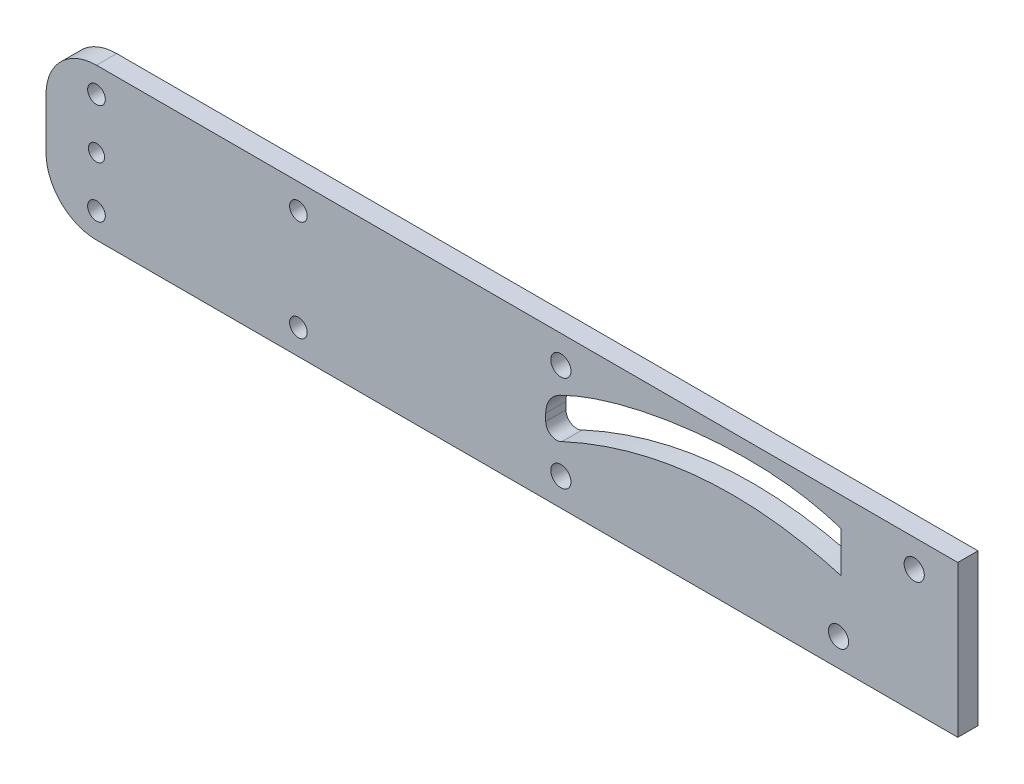
ISO-10303-21;
HEADER;
FILE_DESCRIPTION(('STEP AP214'),'2;1');
FILE_NAME('part.step','',(''),(''),'','','');
FILE_SCHEMA(('AUTOMOTIVE_DESIGN { 1 0 10303 214 1 1 1 1 }'));
ENDSEC;
DATA;
#1=APPLICATION_CONTEXT('core data for automotive mechanical design processes');
#2=APPLICATION_PROTOCOL_DEFINITION('international standard','automotive_design',2000,#1);
#3=PRODUCT_CONTEXT('',#1,'mechanical');
#4=PRODUCT('Part','Part','',(#3));
#5=PRODUCT_RELATED_PRODUCT_CATEGORY('part','',(#4));
#6=PRODUCT_DEFINITION_FORMATION('','',#4);
#7=PRODUCT_DEFINITION_CONTEXT('part definition',#1,'design');
#8=PRODUCT_DEFINITION('design','',#6,#7);
#9=PRODUCT_DEFINITION_SHAPE('','',#8);
#10=(LENGTH_UNIT() NAMED_UNIT(*) SI_UNIT(.MILLI.,.METRE.));
#11=(NAMED_UNIT(*) PLANE_ANGLE_UNIT() SI_UNIT($,.RADIAN.));
#12=(NAMED_UNIT(*) SI_UNIT($,.STERADIAN.) SOLID_ANGLE_UNIT());
#13=UNCERTAINTY_MEASURE_WITH_UNIT(LENGTH_MEASURE(1.E-05),#10,'distance_accuracy_value','');
#14=(GEOMETRIC_REPRESENTATION_CONTEXT(3) GLOBAL_UNCERTAINTY_ASSIGNED_CONTEXT((#13)) GLOBAL_UNIT_ASSIGNED_CONTEXT((#10,
#11,#12)) REPRESENTATION_CONTEXT('',''));
#15=CARTESIAN_POINT('',(0.,0.,0.));
#16=DIRECTION('',(0.,0.,1.));
#17=DIRECTION('',(1.,0.,0.));
#18=AXIS2_PLACEMENT_3D('',#15,#16,#17);
#19=CARTESIAN_POINT('',(-61.74271371787,-0.880933602132559,10.));
#20=CARTESIAN_POINT('',(-32.6636334906638,12.5455996530614,10.));
#21=CARTESIAN_POINT('',(-3.21353823021199,2.72288002919137,10.));
#22=B_SPLINE_CURVE_WITH_KNOTS('',2,(#19,#20,#21),.UNSPECIFIED.,.F.,.F.,(3,3),(0.,1.),.UNSPECIFIED.);
#23=DIRECTION('',(0.,0.,1.));
#24=VECTOR('',#23,1.);
#25=SURFACE_OF_LINEAR_EXTRUSION('',#22,#24);
#26=DIRECTION('',(0.,0.,1.));
#27=VECTOR('',#26,1.);
#28=CARTESIAN_POINT('',(-61.74271371787,-0.88093360213256,10.));
#29=LINE('',#28,#27);
#30=CARTESIAN_POINT('',(-61.74271371787,-0.88093360213256,16.));
#31=VERTEX_POINT('',#30);
#32=CARTESIAN_POINT('',(-61.74271371787,-0.88093360213256,20.));
#33=VERTEX_POINT('',#32);
#34=EDGE_CURVE('E154',#31,#33,#29,.T.);
#35=ORIENTED_EDGE('',*,*,#34,.T.);
#36=CARTESIAN_POINT('',(-61.74271371787,-0.880933602132559,20.));
#37=CARTESIAN_POINT('',(-32.6636334906638,12.5455996530614,20.));
#38=CARTESIAN_POINT('',(-3.21353823021199,2.72288002919137,20.));
#39=B_SPLINE_CURVE_WITH_KNOTS('',2,(#36,#37,#38),.UNSPECIFIED.,.F.,.F.,(3,3),(0.,1.),.UNSPECIFIED.);
#40=CARTESIAN_POINT('',(-6.49935616242203,3.74680495628913,20.));
#41=VERTEX_POINT('',#40);
#42=EDGE_CURVE('E137',#33,#41,#39,.T.);
#43=ORIENTED_EDGE('',*,*,#42,.T.);
#44=DIRECTION('',(0.,0.,1.));
#45=VECTOR('',#44,1.);
#46=CARTESIAN_POINT('',(-6.49935616242203,3.74680495607621,25.5));
#47=LINE('',#46,#45);
#48=CARTESIAN_POINT('',(-6.49935616315701,3.74680495628913,16.));
#49=VERTEX_POINT('',#48);
#50=EDGE_CURVE('E234',#41,#49,#47,.F.);
#51=ORIENTED_EDGE('',*,*,#50,.T.);
#52=CARTESIAN_POINT('',(-61.74271371787,-0.880933602132559,16.));
#53=CARTESIAN_POINT('',(-32.6636334906638,12.5455996530614,16.));
#54=CARTESIAN_POINT('',(-3.21353823021199,2.72288002919137,16.));
#55=B_SPLINE_CURVE_WITH_KNOTS('',2,(#52,#53,#54),.UNSPECIFIED.,.F.,.F.,(3,3),(0.,1.),.UNSPECIFIED.);
#56=EDGE_CURVE('E257',#31,#49,#55,.T.);
#57=ORIENTED_EDGE('',*,*,#56,.F.);
#58=EDGE_LOOP('',(#35,#43,#51,#57));
#59=FACE_BOUND('',#58,.T.);
#60=ADVANCED_FACE('F35',(#59),#25,.F.);
#61=CARTESIAN_POINT('',(-62.8625417760023,0.939701665996412,10.));
#62=DIRECTION('',(0.,0.,1.));
#63=DIRECTION('',(1.,0.,0.));
#64=AXIS2_PLACEMENT_3D('',#61,#62,#63);
#65=CYLINDRICAL_SURFACE('',#64,2.13745822399768);
#66=CARTESIAN_POINT('',(-62.8625417760023,0.939701665996412,20.));
#67=DIRECTION('',(0.,0.,-1.));
#68=DIRECTION('',(0.,1.,0.));
#69=AXIS2_PLACEMENT_3D('',#66,#67,#68);
#70=CIRCLE('',#69,2.13745822399768);
#71=CARTESIAN_POINT('',(-65.,0.939701665996412,20.));
#72=VERTEX_POINT('',#71);
#73=EDGE_CURVE('E221',#33,#72,#70,.T.);
#74=ORIENTED_EDGE('',*,*,#73,.F.);
#75=ORIENTED_EDGE('',*,*,#34,.F.);
#76=CARTESIAN_POINT('',(-62.8625417760023,0.939701665996412,16.));
#77=DIRECTION('',(0.,0.,-1.));
#78=DIRECTION('',(-1.,0.,0.));
#79=AXIS2_PLACEMENT_3D('',#76,#77,#78);
#80=CIRCLE('',#79,2.13745822399768);
#81=CARTESIAN_POINT('',(-65.,0.939701665996412,16.));
#82=VERTEX_POINT('',#81);
#83=EDGE_CURVE('E254',#31,#82,#80,.T.);
#84=ORIENTED_EDGE('',*,*,#83,.T.);
#85=DIRECTION('',(0.,0.,1.));
#86=VECTOR('',#85,1.);
#87=CARTESIAN_POINT('',(-65.,0.939701665996412,10.));
#88=LINE('',#87,#86);
#89=EDGE_CURVE('E372',#82,#72,#88,.T.);
#90=ORIENTED_EDGE('',*,*,#89,.T.);
#91=EDGE_LOOP('',(#74,#75,#84,#90));
#92=FACE_BOUND('',#91,.T.);
#93=ADVANCED_FACE('F280',(#92),#65,.F.);
#94=CARTESIAN_POINT('',(-65.,6.33697436120582E-13,10.));
#95=DIRECTION('',(1.,0.,0.));
#96=DIRECTION('',(0.,1.,0.));
#97=AXIS2_PLACEMENT_3D('',#94,#95,#96);
#98=PLANE('',#97);
#99=DIRECTION('',(0.,1.,0.));
#100=VECTOR('',#99,1.);
#101=CARTESIAN_POINT('',(-65.,6.34853775883272E-13,20.));
#102=LINE('',#101,#100);
#103=CARTESIAN_POINT('',(-64.9999999999993,2.36318258305711,20.));
#104=VERTEX_POINT('',#103);
#105=EDGE_CURVE('E219',#72,#104,#102,.T.);
#106=ORIENTED_EDGE('',*,*,#105,.F.);
#107=ORIENTED_EDGE('',*,*,#89,.F.);
#108=DIRECTION('',(0.,1.,0.));
#109=VECTOR('',#108,1.);
#110=CARTESIAN_POINT('',(-65.,6.33697436120582E-13,16.));
#111=LINE('',#110,#109);
#112=CARTESIAN_POINT('',(-64.9999999999993,2.36318258305711,16.));
#113=VERTEX_POINT('',#112);
#114=EDGE_CURVE('E251',#82,#113,#111,.T.);
#115=ORIENTED_EDGE('',*,*,#114,.T.);
#116=DIRECTION('',(0.,0.,1.));
#117=VECTOR('',#116,1.);
#118=CARTESIAN_POINT('',(-65.,2.36318258305711,10.));
#119=LINE('',#118,#117);
#120=EDGE_CURVE('E365',#113,#104,#119,.T.);
#121=ORIENTED_EDGE('',*,*,#120,.T.);
#122=EDGE_LOOP('',(#106,#107,#115,#121));
#123=FACE_BOUND('',#122,.T.);
#124=ADVANCED_FACE('F350',(#123),#98,.T.);
#125=CARTESIAN_POINT('',(-59.999999999998,2.36318258305711,10.));
#126=DIRECTION('',(0.,0.,1.));
#127=DIRECTION('',(1.,0.,0.));
#128=AXIS2_PLACEMENT_3D('',#125,#126,#127);
#129=CYLINDRICAL_SURFACE('',#128,5.00000000000135);
#130=CARTESIAN_POINT('',(-59.999999999998,2.36318258305711,20.));
#131=DIRECTION('',(0.,0.,-1.));
#132=DIRECTION('',(0.,1.,0.));
#133=AXIS2_PLACEMENT_3D('',#130,#131,#132);
#134=CIRCLE('',#133,5.00000000000135);
#135=CARTESIAN_POINT('',(-62.2254862607893,6.84059376621149,20.));
#136=VERTEX_POINT('',#135);
#137=EDGE_CURVE('E214',#104,#136,#134,.T.);
#138=ORIENTED_EDGE('',*,*,#137,.F.);
#139=ORIENTED_EDGE('',*,*,#120,.F.);
#140=CARTESIAN_POINT('',(-59.999999999998,2.36318258305711,16.));
#141=DIRECTION('',(0.,0.,-1.));
#142=DIRECTION('',(-1.,0.,0.));
#143=AXIS2_PLACEMENT_3D('',#140,#141,#142);
#144=CIRCLE('',#143,5.00000000000135);
#145=CARTESIAN_POINT('',(-62.2254862607893,6.84059376621149,16.));
#146=VERTEX_POINT('',#145);
#147=EDGE_CURVE('E245',#113,#146,#144,.T.);
#148=ORIENTED_EDGE('',*,*,#147,.T.);
#149=DIRECTION('',(0.,0.,1.));
#150=VECTOR('',#149,1.);
#151=CARTESIAN_POINT('',(-62.2254862607896,6.8405937662121,10.));
#152=LINE('',#151,#150);
#153=EDGE_CURVE('E262',#146,#136,#152,.T.);
#154=ORIENTED_EDGE('',*,*,#153,.T.);
#155=EDGE_LOOP('',(#138,#139,#148,#154));
#156=FACE_BOUND('',#155,.T.);
#157=ADVANCED_FACE('F353',(#156),#129,.F.);
#158=CARTESIAN_POINT('',(-65.4125422603224,5.0799444777887,10.));
#159=CARTESIAN_POINT('',(-64.6366210407416,5.55764647421509,10.));
#160=CARTESIAN_POINT('',(-63.3295020509311,6.29571799966948,10.));
#161=CARTESIAN_POINT('',(-60.9335870207585,7.48567797955336,10.));
#162=CARTESIAN_POINT('',(-56.7872580294598,9.27091368488656,10.));
#163=CARTESIAN_POINT('',(-50.2064140353374,11.3712568324939,10.));
#164=CARTESIAN_POINT('',(-41.4941584336822,13.2094041550009,10.));
#165=CARTESIAN_POINT('',(-32.6009653235692,14.2992332413665,10.));
#166=CARTESIAN_POINT('',(-23.9020538600208,14.6458002756998,10.));
#167=CARTESIAN_POINT('',(-15.4142627104443,14.0742795851284,10.));
#168=CARTESIAN_POINT('',(-7.27405135663202,12.3367420642671,10.));
#169=CARTESIAN_POINT('',(-2.14720505081484,10.1713442367808,10.));
#170=CARTESIAN_POINT('',(0.250220447481637,8.8063228385101,10.));
#171=B_SPLINE_CURVE_WITH_KNOTS('',3,(#158,#159,#160,#161,#162,#163,#164,#165,#166,#167,#168,
#169,#170),.UNSPECIFIED.,.F.,.F.,(4,1,1,1,1,1,1,1,1,1,4),(0.0700638837034009,0.105544545229762,
0.12919831958067,0.172962491612376,0.275861099521351,0.378759707430326,0.481658315339301,
0.584556923248275,0.68745553115725,0.790354139066225,0.8932527469752),.UNSPECIFIED.);
#172=DIRECTION('',(0.,0.,1.));
#173=VECTOR('',#172,1.);
#174=SURFACE_OF_LINEAR_EXTRUSION('',#171,#173);
#175=CARTESIAN_POINT('',(-65.4125422603224,5.0799444777887,20.));
#176=CARTESIAN_POINT('',(-64.6366210407416,5.55764647421509,20.));
#177=CARTESIAN_POINT('',(-63.3295020509311,6.29571799966948,20.));
#178=CARTESIAN_POINT('',(-60.9335870207585,7.48567797955336,20.));
#179=CARTESIAN_POINT('',(-56.7872580294598,9.27091368488656,20.));
#180=CARTESIAN_POINT('',(-50.2064140353374,11.3712568324939,20.));
#181=CARTESIAN_POINT('',(-41.4941584336822,13.2094041550009,20.));
#182=CARTESIAN_POINT('',(-32.6009653235692,14.2992332413665,20.));
#183=CARTESIAN_POINT('',(-23.9020538600208,14.6458002756998,20.));
#184=CARTESIAN_POINT('',(-15.4142627104443,14.0742795851284,20.));
#185=CARTESIAN_POINT('',(-7.27405135663202,12.3367420642671,20.));
#186=CARTESIAN_POINT('',(-2.14720505081484,10.1713442367808,20.));
#187=CARTESIAN_POINT('',(0.250220447481637,8.8063228385101,20.));
#188=B_SPLINE_CURVE_WITH_KNOTS('',3,(#175,#176,#177,#178,#179,#180,#181,#182,#183,#184,#185,
#186,#187),.UNSPECIFIED.,.F.,.F.,(4,1,1,1,1,1,1,1,1,1,4),(0.0700638837034009,0.105544545229762,
0.12919831958067,0.172962491612376,0.275861099521351,0.378759707430326,0.481658315339301,
0.584556923248275,0.68745553115725,0.790354139066225,0.8932527469752),.UNSPECIFIED.);
#189=CARTESIAN_POINT('',(-6.49935616242204,11.8077280797058,20.));
#190=VERTEX_POINT('',#189);
#191=EDGE_CURVE('E144',#136,#190,#188,.T.);
#192=ORIENTED_EDGE('',*,*,#191,.F.);
#193=ORIENTED_EDGE('',*,*,#153,.F.);
#194=CARTESIAN_POINT('',(-65.4125422603224,5.0799444777887,16.));
#195=CARTESIAN_POINT('',(-64.6366210407416,5.55764647421509,16.));
#196=CARTESIAN_POINT('',(-63.3295020509311,6.29571799966948,16.));
#197=CARTESIAN_POINT('',(-60.9335870207585,7.48567797955336,16.));
#198=CARTESIAN_POINT('',(-56.7872580294598,9.27091368488656,16.));
#199=CARTESIAN_POINT('',(-50.2064140353374,11.3712568324939,16.));
#200=CARTESIAN_POINT('',(-41.4941584336822,13.2094041550009,16.));
#201=CARTESIAN_POINT('',(-32.6009653235692,14.2992332413665,16.));
#202=CARTESIAN_POINT('',(-23.9020538600208,14.6458002756998,16.));
#203=CARTESIAN_POINT('',(-15.4142627104443,14.0742795851284,16.));
#204=CARTESIAN_POINT('',(-7.27405135663202,12.3367420642671,16.));
#205=CARTESIAN_POINT('',(-2.14720505081484,10.1713442367808,16.));
#206=CARTESIAN_POINT('',(0.250220447481637,8.8063228385101,16.));
#207=B_SPLINE_CURVE_WITH_KNOTS('',3,(#194,#195,#196,#197,#198,#199,#200,#201,#202,#203,#204,
#205,#206),.UNSPECIFIED.,.F.,.F.,(4,1,1,1,1,1,1,1,1,1,4),(0.0700638837034009,0.105544545229762,
0.12919831958067,0.172962491612376,0.275861099521351,0.378759707430326,0.481658315339301,
0.584556923248275,0.68745553115725,0.790354139066225,0.8932527469752),.UNSPECIFIED.);
#208=CARTESIAN_POINT('',(-6.49935616242086,11.8077280797054,16.));
#209=VERTEX_POINT('',#208);
#210=EDGE_CURVE('E240',#146,#209,#207,.T.);
#211=ORIENTED_EDGE('',*,*,#210,.T.);
#212=DIRECTION('',(0.,0.,1.));
#213=VECTOR('',#212,1.);
#214=CARTESIAN_POINT('',(-6.49935616242204,11.8077280797058,25.5));
#215=LINE('',#214,#213);
#216=EDGE_CURVE('E232',#190,#209,#215,.F.);
#217=ORIENTED_EDGE('',*,*,#216,.F.);
#218=EDGE_LOOP('',(#192,#193,#211,#217));
#219=FACE_BOUND('',#218,.T.);
#220=ADVANCED_FACE('F282',(#219),#174,.T.);
#221=CARTESIAN_POINT('',(0.,0.,16.));
#222=DIRECTION('',(0.,0.,-1.));
#223=DIRECTION('',(-1.,0.,0.));
#224=AXIS2_PLACEMENT_3D('',#221,#222,#223);
#225=PLANE('',#224);
#226=CARTESIAN_POINT('',(-114.,-7.43184921377034,16.));
#227=DIRECTION('',(0.,0.,-1.));
#228=DIRECTION('',(-1.,0.,0.));
#229=AXIS2_PLACEMENT_3D('',#226,#227,#228);
#230=CIRCLE('',#229,1.75);
#231=CARTESIAN_POINT('',(-115.75,-7.43184921377034,16.));
#232=VERTEX_POINT('',#231);
#233=EDGE_CURVE('E178',#232,#232,#230,.T.);
#234=ORIENTED_EDGE('',*,*,#233,.F.);
#235=EDGE_LOOP('',(#234));
#236=FACE_BOUND('',#235,.T.);
#237=CARTESIAN_POINT('',(-154.,-7.43184921377033,16.));
#238=DIRECTION('',(0.,0.,-1.));
#239=DIRECTION('',(-1.,0.,0.));
#240=AXIS2_PLACEMENT_3D('',#237,#238,#239);
#241=CIRCLE('',#240,1.75000000000001);
#242=CARTESIAN_POINT('',(-155.75,-7.43184921377033,16.));
#243=VERTEX_POINT('',#242);
#244=EDGE_CURVE('E174',#243,#243,#241,.T.);
#245=ORIENTED_EDGE('',*,*,#244,.F.);
#246=EDGE_LOOP('',(#245));
#247=FACE_BOUND('',#246,.T.);
#248=CARTESIAN_POINT('',(-154.,12.5681507862297,16.));
#249=DIRECTION('',(0.,0.,-1.));
#250=DIRECTION('',(-1.,0.,0.));
#251=AXIS2_PLACEMENT_3D('',#248,#249,#250);
#252=CIRCLE('',#251,1.75000000000001);
#253=CARTESIAN_POINT('',(-155.75,12.5681507862297,16.));
#254=VERTEX_POINT('',#253);
#255=EDGE_CURVE('E170',#254,#254,#252,.T.);
#256=ORIENTED_EDGE('',*,*,#255,.F.);
#257=EDGE_LOOP('',(#256));
#258=FACE_BOUND('',#257,.T.);
#259=CARTESIAN_POINT('',(-114.,12.5681507862297,16.));
#260=DIRECTION('',(0.,0.,-1.));
#261=DIRECTION('',(-1.,0.,0.));
#262=AXIS2_PLACEMENT_3D('',#259,#260,#261);
#263=CIRCLE('',#262,1.75);
#264=CARTESIAN_POINT('',(-115.75,12.5681507862297,16.));
#265=VERTEX_POINT('',#264);
#266=EDGE_CURVE('E166',#265,#265,#263,.T.);
#267=ORIENTED_EDGE('',*,*,#266,.F.);
#268=EDGE_LOOP('',(#267));
#269=FACE_BOUND('',#268,.T.);
#270=CARTESIAN_POINT('',(-154.,2.56815078622967,16.));
#271=DIRECTION('',(0.,0.,-1.));
#272=DIRECTION('',(-1.,0.,0.));
#273=AXIS2_PLACEMENT_3D('',#270,#271,#272);
#274=CIRCLE('',#273,1.59999999999999);
#275=CARTESIAN_POINT('',(-155.6,2.56815078622967,16.));
#276=VERTEX_POINT('',#275);
#277=EDGE_CURVE('E162',#276,#276,#274,.T.);
#278=ORIENTED_EDGE('',*,*,#277,.F.);
#279=EDGE_LOOP('',(#278));
#280=FACE_BOUND('',#279,.T.);
#281=CARTESIAN_POINT('',(-6.99999999999998,-6.93369842754066,16.));
#282=DIRECTION('',(0.,0.,-1.));
#283=DIRECTION('',(-1.,0.,0.));
#284=AXIS2_PLACEMENT_3D('',#281,#282,#283);
#285=CIRCLE('',#284,2.);
#286=CARTESIAN_POINT('',(-8.99999999999998,-6.93369842754066,16.));
#287=VERTEX_POINT('',#286);
#288=EDGE_CURVE('E553',#287,#287,#285,.T.);
#289=ORIENTED_EDGE('',*,*,#288,.F.);
#290=EDGE_LOOP('',(#289));
#291=FACE_BOUND('',#290,.T.);
#292=CARTESIAN_POINT('',(-62.,-6.93369842754066,16.));
#293=DIRECTION('',(0.,0.,-1.));
#294=DIRECTION('',(-1.,0.,0.));
#295=AXIS2_PLACEMENT_3D('',#292,#293,#294);
#296=CIRCLE('',#295,2.);
#297=CARTESIAN_POINT('',(-64.,-6.93369842754066,16.));
#298=VERTEX_POINT('',#297);
#299=EDGE_CURVE('E557',#298,#298,#296,.T.);
#300=ORIENTED_EDGE('',*,*,#299,.F.);
#301=EDGE_LOOP('',(#300));
#302=FACE_BOUND('',#301,.T.);
#303=CARTESIAN_POINT('',(8.00000000000004,12.07,16.));
#304=DIRECTION('',(0.,0.,-1.));
#305=DIRECTION('',(-1.,0.,0.));
#306=AXIS2_PLACEMENT_3D('',#303,#304,#305);
#307=CIRCLE('',#306,2.);
#308=CARTESIAN_POINT('',(6.00000000000003,12.07,16.));
#309=VERTEX_POINT('',#308);
#310=EDGE_CURVE('E561',#309,#309,#307,.T.);
#311=ORIENTED_EDGE('',*,*,#310,.F.);
#312=EDGE_LOOP('',(#311));
#313=FACE_BOUND('',#312,.T.);
#314=CARTESIAN_POINT('',(-62.,12.07,16.));
#315=DIRECTION('',(0.,0.,-1.));
#316=DIRECTION('',(-1.,0.,0.));
#317=AXIS2_PLACEMENT_3D('',#314,#315,#316);
#318=CIRCLE('',#317,2.);
#319=CARTESIAN_POINT('',(-64.,12.07,16.));
#320=VERTEX_POINT('',#319);
#321=EDGE_CURVE('E207',#320,#320,#318,.T.);
#322=ORIENTED_EDGE('',*,*,#321,.F.);
#323=EDGE_LOOP('',(#322));
#324=FACE_BOUND('',#323,.T.);
#325=DIRECTION('',(1.,0.,0.));
#326=VECTOR('',#325,1.);
#327=CARTESIAN_POINT('',(0.,-12.4336984275407,16.));
#328=LINE('',#327,#326);
#329=CARTESIAN_POINT('',(-154.,-12.4336984275407,16.));
#330=VERTEX_POINT('',#329);
#331=CARTESIAN_POINT('',(16.6382957488409,-12.4336984275407,16.));
#332=VERTEX_POINT('',#331);
#333=EDGE_CURVE('E150',#330,#332,#328,.T.);
#334=ORIENTED_EDGE('',*,*,#333,.F.);
#335=CARTESIAN_POINT('',(-154.,-2.43369842754066,16.));
#336=DIRECTION('',(0.,0.,-1.));
#337=DIRECTION('',(-1.,0.,0.));
#338=AXIS2_PLACEMENT_3D('',#335,#336,#337);
#339=CIRCLE('',#338,10.);
#340=CARTESIAN_POINT('',(-164.,-2.43369842754066,16.));
#341=VERTEX_POINT('',#340);
#342=EDGE_CURVE('E43',#330,#341,#339,.T.);
#343=ORIENTED_EDGE('',*,*,#342,.T.);
#344=DIRECTION('',(0.,-1.,0.));
#345=VECTOR('',#344,1.);
#346=CARTESIAN_POINT('',(-164.,17.57,16.));
#347=LINE('',#346,#345);
#348=CARTESIAN_POINT('',(-164.,7.57,16.));
#349=VERTEX_POINT('',#348);
#350=EDGE_CURVE('E161',#349,#341,#347,.T.);
#351=ORIENTED_EDGE('',*,*,#350,.F.);
#352=CARTESIAN_POINT('',(-154.,7.57,16.));
#353=DIRECTION('',(0.,0.,-1.));
#354=DIRECTION('',(-1.,0.,0.));
#355=AXIS2_PLACEMENT_3D('',#352,#353,#354);
#356=CIRCLE('',#355,10.);
#357=CARTESIAN_POINT('',(-154.,17.57,16.));
#358=VERTEX_POINT('',#357);
#359=EDGE_CURVE('E50',#349,#358,#356,.T.);
#360=ORIENTED_EDGE('',*,*,#359,.T.);
#361=DIRECTION('',(-1.,0.,0.));
#362=VECTOR('',#361,1.);
#363=CARTESIAN_POINT('',(49.0535411922696,17.57,16.));
#364=LINE('',#363,#362);
#365=CARTESIAN_POINT('',(16.6382957488409,17.57,16.));
#366=VERTEX_POINT('',#365);
#367=EDGE_CURVE('E238',#366,#358,#364,.T.);
#368=ORIENTED_EDGE('',*,*,#367,.F.);
#369=DIRECTION('',(0.,1.,0.));
#370=VECTOR('',#369,1.);
#371=CARTESIAN_POINT('',(16.6382957488409,23.1006170609746,16.));
#372=LINE('',#371,#370);
#373=EDGE_CURVE('E148',#332,#366,#372,.T.);
#374=ORIENTED_EDGE('',*,*,#373,.F.);
#375=EDGE_LOOP('',(#334,#343,#351,#360,#368,#374));
#376=FACE_BOUND('',#375,.T.);
#377=ORIENTED_EDGE('',*,*,#56,.T.);
#378=DIRECTION('',(0.,1.,0.));
#379=VECTOR('',#378,1.);
#380=CARTESIAN_POINT('',(-6.49935616242203,17.57,16.));
#381=LINE('',#380,#379);
#382=EDGE_CURVE('E136',#49,#209,#381,.T.);
#383=ORIENTED_EDGE('',*,*,#382,.T.);
#384=ORIENTED_EDGE('',*,*,#210,.F.);
#385=ORIENTED_EDGE('',*,*,#147,.F.);
#386=ORIENTED_EDGE('',*,*,#114,.F.);
#387=ORIENTED_EDGE('',*,*,#83,.F.);
#388=EDGE_LOOP('',(#377,#383,#384,#385,#386,#387));
#389=FACE_BOUND('',#388,.T.);
#390=ADVANCED_FACE('F191',(#236,#247,#258,#269,#280,#291,#302,#313,#324,#376,#389),#225,.T.);
#391=CARTESIAN_POINT('',(-70.,-12.4336984275407,2.));
#392=DIRECTION('',(0.,1.,0.));
#393=DIRECTION('',(-1.,0.,0.));
#394=AXIS2_PLACEMENT_3D('',#391,#392,#393);
#395=PLANE('',#394);
#396=DIRECTION('',(-1.,0.,0.));
#397=VECTOR('',#396,1.);
#398=CARTESIAN_POINT('',(80.,-12.4336984275407,20.));
#399=LINE('',#398,#397);
#400=CARTESIAN_POINT('',(16.6382957488409,-12.4336984275407,20.));
#401=VERTEX_POINT('',#400);
#402=CARTESIAN_POINT('',(-154.,-12.4336984275407,20.));
#403=VERTEX_POINT('',#402);
#404=EDGE_CURVE('E131',#401,#403,#399,.T.);
#405=ORIENTED_EDGE('',*,*,#404,.T.);
#406=DIRECTION('',(0.,0.,1.));
#407=VECTOR('',#406,1.);
#408=CARTESIAN_POINT('',(-154.,-12.4336984275407,16.));
#409=LINE('',#408,#407);
#410=EDGE_CURVE('E58',#403,#330,#409,.F.);
#411=ORIENTED_EDGE('',*,*,#410,.T.);
#412=ORIENTED_EDGE('',*,*,#333,.T.);
#413=DIRECTION('',(0.,0.,1.));
#414=VECTOR('',#413,1.);
#415=CARTESIAN_POINT('',(16.6382957488409,-12.4336984275407,2.));
#416=LINE('',#415,#414);
#417=EDGE_CURVE('E203',#332,#401,#416,.T.);
#418=ORIENTED_EDGE('',*,*,#417,.T.);
#419=EDGE_LOOP('',(#405,#411,#412,#418));
#420=FACE_BOUND('',#419,.T.);
#421=ADVANCED_FACE('F202',(#420),#395,.F.);
#422=CARTESIAN_POINT('',(49.0535411922696,17.57,41.));
#423=DIRECTION('',(0.,-1.,0.));
#424=DIRECTION('',(0.,0.,-1.));
#425=AXIS2_PLACEMENT_3D('',#422,#423,#424);
#426=PLANE('',#425);
#427=ORIENTED_EDGE('',*,*,#367,.T.);
#428=DIRECTION('',(0.,0.,-1.));
#429=VECTOR('',#428,1.);
#430=CARTESIAN_POINT('',(-154.,17.57,20.));
#431=LINE('',#430,#429);
#432=CARTESIAN_POINT('',(-154.,17.57,20.));
#433=VERTEX_POINT('',#432);
#434=EDGE_CURVE('E11',#358,#433,#431,.F.);
#435=ORIENTED_EDGE('',*,*,#434,.T.);
#436=DIRECTION('',(-1.,0.,0.));
#437=VECTOR('',#436,1.);
#438=CARTESIAN_POINT('',(80.,17.57,20.));
#439=LINE('',#438,#437);
#440=CARTESIAN_POINT('',(16.6382957488409,17.57,20.));
#441=VERTEX_POINT('',#440);
#442=EDGE_CURVE('E129',#441,#433,#439,.T.);
#443=ORIENTED_EDGE('',*,*,#442,.F.);
#444=DIRECTION('',(0.,0.,-1.));
#445=VECTOR('',#444,1.);
#446=CARTESIAN_POINT('',(16.6382957488409,17.57,41.));
#447=LINE('',#446,#445);
#448=EDGE_CURVE('E141',#441,#366,#447,.T.);
#449=ORIENTED_EDGE('',*,*,#448,.T.);
#450=EDGE_LOOP('',(#427,#435,#443,#449));
#451=FACE_BOUND('',#450,.T.);
#452=ADVANCED_FACE('F140',(#451),#426,.F.);
#453=CARTESIAN_POINT('',(16.6382957488409,23.1006170609746,66.));
#454=DIRECTION('',(-1.,0.,0.));
#455=DIRECTION('',(0.,-1.,0.));
#456=AXIS2_PLACEMENT_3D('',#453,#454,#455);
#457=PLANE('',#456);
#458=ORIENTED_EDGE('',*,*,#448,.F.);
#459=DIRECTION('',(0.,-1.,0.));
#460=VECTOR('',#459,1.);
#461=CARTESIAN_POINT('',(16.6382957488409,23.1006170609746,20.));
#462=LINE('',#461,#460);
#463=EDGE_CURVE('E125',#441,#401,#462,.T.);
#464=ORIENTED_EDGE('',*,*,#463,.T.);
#465=ORIENTED_EDGE('',*,*,#417,.F.);
#466=ORIENTED_EDGE('',*,*,#373,.T.);
#467=EDGE_LOOP('',(#458,#464,#465,#466));
#468=FACE_BOUND('',#467,.T.);
#469=ADVANCED_FACE('F146',(#468),#457,.F.);
#470=CARTESIAN_POINT('',(-6.49935616242203,17.57,35.));
#471=DIRECTION('',(-1.,0.,0.));
#472=DIRECTION('',(0.,0.,1.));
#473=AXIS2_PLACEMENT_3D('',#470,#471,#472);
#474=PLANE('',#473);
#475=DIRECTION('',(0.,-1.,0.));
#476=VECTOR('',#475,1.);
#477=CARTESIAN_POINT('',(-6.49935616242203,17.57,20.));
#478=LINE('',#477,#476);
#479=EDGE_CURVE('E149',#190,#41,#478,.T.);
#480=ORIENTED_EDGE('',*,*,#479,.F.);
#481=ORIENTED_EDGE('',*,*,#216,.T.);
#482=ORIENTED_EDGE('',*,*,#382,.F.);
#483=ORIENTED_EDGE('',*,*,#50,.F.);
#484=EDGE_LOOP('',(#480,#481,#482,#483));
#485=FACE_BOUND('',#484,.T.);
#486=ADVANCED_FACE('F334',(#485),#474,.T.);
#487=CARTESIAN_POINT('',(80.,17.57,20.));
#488=DIRECTION('',(0.,0.,-1.));
#489=DIRECTION('',(0.,1.,0.));
#490=AXIS2_PLACEMENT_3D('',#487,#488,#489);
#491=PLANE('',#490);
#492=CARTESIAN_POINT('',(-114.,-7.43184921377034,20.));
#493=DIRECTION('',(0.,0.,-1.));
#494=DIRECTION('',(0.,1.,0.));
#495=AXIS2_PLACEMENT_3D('',#492,#493,#494);
#496=CIRCLE('',#495,1.75);
#497=CARTESIAN_POINT('',(-114.,-5.68184921377034,20.));
#498=VERTEX_POINT('',#497);
#499=EDGE_CURVE('E175',#498,#498,#496,.T.);
#500=ORIENTED_EDGE('',*,*,#499,.T.);
#501=EDGE_LOOP('',(#500));
#502=FACE_BOUND('',#501,.T.);
#503=CARTESIAN_POINT('',(-154.,-7.43184921377033,20.));
#504=DIRECTION('',(0.,0.,-1.));
#505=DIRECTION('',(0.,1.,0.));
#506=AXIS2_PLACEMENT_3D('',#503,#504,#505);
#507=CIRCLE('',#506,1.75000000000001);
#508=CARTESIAN_POINT('',(-154.,-5.68184921377032,20.));
#509=VERTEX_POINT('',#508);
#510=EDGE_CURVE('E171',#509,#509,#507,.T.);
#511=ORIENTED_EDGE('',*,*,#510,.T.);
#512=EDGE_LOOP('',(#511));
#513=FACE_BOUND('',#512,.T.);
#514=CARTESIAN_POINT('',(-154.,12.5681507862297,20.));
#515=DIRECTION('',(0.,0.,-1.));
#516=DIRECTION('',(0.,1.,0.));
#517=AXIS2_PLACEMENT_3D('',#514,#515,#516);
#518=CIRCLE('',#517,1.75000000000001);
#519=CARTESIAN_POINT('',(-154.,14.3181507862297,20.));
#520=VERTEX_POINT('',#519);
#521=EDGE_CURVE('E167',#520,#520,#518,.T.);
#522=ORIENTED_EDGE('',*,*,#521,.T.);
#523=EDGE_LOOP('',(#522));
#524=FACE_BOUND('',#523,.T.);
#525=CARTESIAN_POINT('',(-114.,12.5681507862297,20.));
#526=DIRECTION('',(0.,0.,-1.));
#527=DIRECTION('',(0.,1.,0.));
#528=AXIS2_PLACEMENT_3D('',#525,#526,#527);
#529=CIRCLE('',#528,1.75);
#530=CARTESIAN_POINT('',(-114.,14.3181507862297,20.));
#531=VERTEX_POINT('',#530);
#532=EDGE_CURVE('E163',#531,#531,#529,.T.);
#533=ORIENTED_EDGE('',*,*,#532,.T.);
#534=EDGE_LOOP('',(#533));
#535=FACE_BOUND('',#534,.T.);
#536=CARTESIAN_POINT('',(-154.,2.56815078622967,20.));
#537=DIRECTION('',(0.,0.,-1.));
#538=DIRECTION('',(0.,1.,0.));
#539=AXIS2_PLACEMENT_3D('',#536,#537,#538);
#540=CIRCLE('',#539,1.59999999999999);
#541=CARTESIAN_POINT('',(-154.,4.16815078622966,20.));
#542=VERTEX_POINT('',#541);
#543=EDGE_CURVE('E158',#542,#542,#540,.T.);
#544=ORIENTED_EDGE('',*,*,#543,.T.);
#545=EDGE_LOOP('',(#544));
#546=FACE_BOUND('',#545,.T.);
#547=CARTESIAN_POINT('',(-6.99999999999998,-6.93369842754066,20.));
#548=DIRECTION('',(0.,0.,-1.));
#549=DIRECTION('',(-1.,0.,0.));
#550=AXIS2_PLACEMENT_3D('',#547,#548,#549);
#551=CIRCLE('',#550,2.);
#552=CARTESIAN_POINT('',(-8.99999999999998,-6.93369842754066,20.));
#553=VERTEX_POINT('',#552);
#554=EDGE_CURVE('E572',#553,#553,#551,.T.);
#555=ORIENTED_EDGE('',*,*,#554,.T.);
#556=EDGE_LOOP('',(#555));
#557=FACE_BOUND('',#556,.T.);
#558=CARTESIAN_POINT('',(-62.,-6.93369842754066,20.));
#559=DIRECTION('',(0.,0.,-1.));
#560=DIRECTION('',(-1.,0.,0.));
#561=AXIS2_PLACEMENT_3D('',#558,#559,#560);
#562=CIRCLE('',#561,2.);
#563=CARTESIAN_POINT('',(-64.,-6.93369842754066,20.));
#564=VERTEX_POINT('',#563);
#565=EDGE_CURVE('E569',#564,#564,#562,.T.);
#566=ORIENTED_EDGE('',*,*,#565,.T.);
#567=EDGE_LOOP('',(#566));
#568=FACE_BOUND('',#567,.T.);
#569=CARTESIAN_POINT('',(8.00000000000004,12.07,20.));
#570=DIRECTION('',(0.,0.,-1.));
#571=DIRECTION('',(-1.,0.,0.));
#572=AXIS2_PLACEMENT_3D('',#569,#570,#571);
#573=CIRCLE('',#572,2.);
#574=CARTESIAN_POINT('',(6.00000000000003,12.07,20.));
#575=VERTEX_POINT('',#574);
#576=EDGE_CURVE('E565',#575,#575,#573,.T.);
#577=ORIENTED_EDGE('',*,*,#576,.T.);
#578=EDGE_LOOP('',(#577));
#579=FACE_BOUND('',#578,.T.);
#580=CARTESIAN_POINT('',(-62.,12.07,20.));
#581=DIRECTION('',(0.,0.,-1.));
#582=DIRECTION('',(-1.,0.,0.));
#583=AXIS2_PLACEMENT_3D('',#580,#581,#582);
#584=CIRCLE('',#583,2.);
#585=CARTESIAN_POINT('',(-64.,12.07,20.));
#586=VERTEX_POINT('',#585);
#587=EDGE_CURVE('E204',#586,#586,#584,.T.);
#588=ORIENTED_EDGE('',*,*,#587,.T.);
#589=EDGE_LOOP('',(#588));
#590=FACE_BOUND('',#589,.T.);
#591=ORIENTED_EDGE('',*,*,#73,.T.);
#592=ORIENTED_EDGE('',*,*,#105,.T.);
#593=ORIENTED_EDGE('',*,*,#137,.T.);
#594=ORIENTED_EDGE('',*,*,#191,.T.);
#595=ORIENTED_EDGE('',*,*,#479,.T.);
#596=ORIENTED_EDGE('',*,*,#42,.F.);
#597=EDGE_LOOP('',(#591,#592,#593,#594,#595,#596));
#598=FACE_BOUND('',#597,.T.);
#599=DIRECTION('',(0.,1.,0.));
#600=VECTOR('',#599,1.);
#601=CARTESIAN_POINT('',(-164.,-12.4336984275407,20.));
#602=LINE('',#601,#600);
#603=CARTESIAN_POINT('',(-164.,-2.43369842754066,20.));
#604=VERTEX_POINT('',#603);
#605=CARTESIAN_POINT('',(-164.,7.57,20.));
#606=VERTEX_POINT('',#605);
#607=EDGE_CURVE('E199',#604,#606,#602,.T.);
#608=ORIENTED_EDGE('',*,*,#607,.F.);
#609=CARTESIAN_POINT('',(-154.,-2.43369842754066,20.));
#610=DIRECTION('',(0.,0.,-1.));
#611=DIRECTION('',(0.,1.,0.));
#612=AXIS2_PLACEMENT_3D('',#609,#610,#611);
#613=CIRCLE('',#612,10.);
#614=EDGE_CURVE('E186',#604,#403,#613,.F.);
#615=ORIENTED_EDGE('',*,*,#614,.T.);
#616=ORIENTED_EDGE('',*,*,#404,.F.);
#617=ORIENTED_EDGE('',*,*,#463,.F.);
#618=ORIENTED_EDGE('',*,*,#442,.T.);
#619=CARTESIAN_POINT('',(-154.,7.57,20.));
#620=DIRECTION('',(0.,0.,-1.));
#621=DIRECTION('',(0.,1.,0.));
#622=AXIS2_PLACEMENT_3D('',#619,#620,#621);
#623=CIRCLE('',#622,10.);
#624=EDGE_CURVE('E184',#433,#606,#623,.F.);
#625=ORIENTED_EDGE('',*,*,#624,.T.);
#626=EDGE_LOOP('',(#608,#615,#616,#617,#618,#625));
#627=FACE_BOUND('',#626,.T.);
#628=ADVANCED_FACE('F128',(#502,#513,#524,#535,#546,#557,#568,#579,#590,#598,#627),#491,.F.);
#629=CARTESIAN_POINT('',(-62.,12.07,20.));
#630=DIRECTION('',(0.,0.,-1.));
#631=DIRECTION('',(-1.,0.,0.));
#632=AXIS2_PLACEMENT_3D('',#629,#630,#631);
#633=CYLINDRICAL_SURFACE('',#632,2.);
#634=ORIENTED_EDGE('',*,*,#587,.F.);
#635=EDGE_LOOP('',(#634));
#636=FACE_BOUND('',#635,.T.);
#637=ORIENTED_EDGE('',*,*,#321,.T.);
#638=EDGE_LOOP('',(#637));
#639=FACE_BOUND('',#638,.T.);
#640=ADVANCED_FACE('F327',(#636,#639),#633,.F.);
#641=CARTESIAN_POINT('',(8.00000000000004,12.07,20.));
#642=DIRECTION('',(0.,0.,-1.));
#643=DIRECTION('',(-1.,0.,0.));
#644=AXIS2_PLACEMENT_3D('',#641,#642,#643);
#645=CYLINDRICAL_SURFACE('',#644,2.);
#646=ORIENTED_EDGE('',*,*,#576,.F.);
#647=EDGE_LOOP('',(#646));
#648=FACE_BOUND('',#647,.T.);
#649=ORIENTED_EDGE('',*,*,#310,.T.);
#650=EDGE_LOOP('',(#649));
#651=FACE_BOUND('',#650,.T.);
#652=ADVANCED_FACE('F323',(#648,#651),#645,.F.);
#653=CARTESIAN_POINT('',(-62.,-6.93369842754066,20.));
#654=DIRECTION('',(0.,0.,-1.));
#655=DIRECTION('',(-1.,0.,0.));
#656=AXIS2_PLACEMENT_3D('',#653,#654,#655);
#657=CYLINDRICAL_SURFACE('',#656,2.);
#658=ORIENTED_EDGE('',*,*,#565,.F.);
#659=EDGE_LOOP('',(#658));
#660=FACE_BOUND('',#659,.T.);
#661=ORIENTED_EDGE('',*,*,#299,.T.);
#662=EDGE_LOOP('',(#661));
#663=FACE_BOUND('',#662,.T.);
#664=ADVANCED_FACE('F319',(#660,#663),#657,.F.);
#665=CARTESIAN_POINT('',(-6.99999999999998,-6.93369842754066,20.));
#666=DIRECTION('',(0.,0.,-1.));
#667=DIRECTION('',(-1.,0.,0.));
#668=AXIS2_PLACEMENT_3D('',#665,#666,#667);
#669=CYLINDRICAL_SURFACE('',#668,2.);
#670=ORIENTED_EDGE('',*,*,#554,.F.);
#671=EDGE_LOOP('',(#670));
#672=FACE_BOUND('',#671,.T.);
#673=ORIENTED_EDGE('',*,*,#288,.T.);
#674=EDGE_LOOP('',(#673));
#675=FACE_BOUND('',#674,.T.);
#676=ADVANCED_FACE('F316',(#672,#675),#669,.F.);
#677=CARTESIAN_POINT('',(-164.,0.,0.));
#678=DIRECTION('',(-1.,0.,0.));
#679=DIRECTION('',(0.,0.,1.));
#680=AXIS2_PLACEMENT_3D('',#677,#678,#679);
#681=PLANE('',#680);
#682=ORIENTED_EDGE('',*,*,#350,.T.);
#683=DIRECTION('',(0.,0.,1.));
#684=VECTOR('',#683,1.);
#685=CARTESIAN_POINT('',(-164.,-2.43369842754066,20.));
#686=LINE('',#685,#684);
#687=EDGE_CURVE('E181',#341,#604,#686,.T.);
#688=ORIENTED_EDGE('',*,*,#687,.T.);
#689=ORIENTED_EDGE('',*,*,#607,.T.);
#690=DIRECTION('',(0.,0.,-1.));
#691=VECTOR('',#690,1.);
#692=CARTESIAN_POINT('',(-164.,7.57,16.));
#693=LINE('',#692,#691);
#694=EDGE_CURVE('E152',#606,#349,#693,.T.);
#695=ORIENTED_EDGE('',*,*,#694,.T.);
#696=EDGE_LOOP('',(#682,#688,#689,#695));
#697=FACE_BOUND('',#696,.T.);
#698=ADVANCED_FACE('F196',(#697),#681,.T.);
#699=CARTESIAN_POINT('',(-154.,2.56815078622967,110.));
#700=DIRECTION('',(0.,0.,-1.));
#701=DIRECTION('',(-1.,0.,0.));
#702=AXIS2_PLACEMENT_3D('',#699,#700,#701);
#703=CYLINDRICAL_SURFACE('',#702,1.59999999999999);
#704=ORIENTED_EDGE('',*,*,#277,.T.);
#705=EDGE_LOOP('',(#704));
#706=FACE_BOUND('',#705,.T.);
#707=ORIENTED_EDGE('',*,*,#543,.F.);
#708=EDGE_LOOP('',(#707));
#709=FACE_BOUND('',#708,.T.);
#710=ADVANCED_FACE('F309',(#706,#709),#703,.F.);
#711=CARTESIAN_POINT('',(-114.,12.5681507862297,110.));
#712=DIRECTION('',(0.,0.,-1.));
#713=DIRECTION('',(-1.,0.,0.));
#714=AXIS2_PLACEMENT_3D('',#711,#712,#713);
#715=CYLINDRICAL_SURFACE('',#714,1.75);
#716=ORIENTED_EDGE('',*,*,#266,.T.);
#717=EDGE_LOOP('',(#716));
#718=FACE_BOUND('',#717,.T.);
#719=ORIENTED_EDGE('',*,*,#532,.F.);
#720=EDGE_LOOP('',(#719));
#721=FACE_BOUND('',#720,.T.);
#722=ADVANCED_FACE('F305',(#718,#721),#715,.F.);
#723=CARTESIAN_POINT('',(-154.,12.5681507862297,110.));
#724=DIRECTION('',(0.,0.,-1.));
#725=DIRECTION('',(-1.,0.,0.));
#726=AXIS2_PLACEMENT_3D('',#723,#724,#725);
#727=CYLINDRICAL_SURFACE('',#726,1.75000000000001);
#728=ORIENTED_EDGE('',*,*,#255,.T.);
#729=EDGE_LOOP('',(#728));
#730=FACE_BOUND('',#729,.T.);
#731=ORIENTED_EDGE('',*,*,#521,.F.);
#732=EDGE_LOOP('',(#731));
#733=FACE_BOUND('',#732,.T.);
#734=ADVANCED_FACE('F297',(#730,#733),#727,.F.);
#735=CARTESIAN_POINT('',(-154.,-7.43184921377033,110.));
#736=DIRECTION('',(0.,0.,-1.));
#737=DIRECTION('',(-1.,0.,0.));
#738=AXIS2_PLACEMENT_3D('',#735,#736,#737);
#739=CYLINDRICAL_SURFACE('',#738,1.75000000000001);
#740=ORIENTED_EDGE('',*,*,#244,.T.);
#741=EDGE_LOOP('',(#740));
#742=FACE_BOUND('',#741,.T.);
#743=ORIENTED_EDGE('',*,*,#510,.F.);
#744=EDGE_LOOP('',(#743));
#745=FACE_BOUND('',#744,.T.);
#746=ADVANCED_FACE('F291',(#742,#745),#739,.F.);
#747=CARTESIAN_POINT('',(-114.,-7.43184921377034,110.));
#748=DIRECTION('',(0.,0.,-1.));
#749=DIRECTION('',(-1.,0.,0.));
#750=AXIS2_PLACEMENT_3D('',#747,#748,#749);
#751=CYLINDRICAL_SURFACE('',#750,1.75);
#752=ORIENTED_EDGE('',*,*,#233,.T.);
#753=EDGE_LOOP('',(#752));
#754=FACE_BOUND('',#753,.T.);
#755=ORIENTED_EDGE('',*,*,#499,.F.);
#756=EDGE_LOOP('',(#755));
#757=FACE_BOUND('',#756,.T.);
#758=ADVANCED_FACE('F285',(#754,#757),#751,.F.);
#759=CARTESIAN_POINT('',(-154.,-2.43369842754066,0.));
#760=DIRECTION('',(0.,0.,-1.));
#761=DIRECTION('',(-1.,0.,0.));
#762=AXIS2_PLACEMENT_3D('',#759,#760,#761);
#763=CYLINDRICAL_SURFACE('',#762,10.);
#764=ORIENTED_EDGE('',*,*,#342,.F.);
#765=ORIENTED_EDGE('',*,*,#410,.F.);
#766=ORIENTED_EDGE('',*,*,#614,.F.);
#767=ORIENTED_EDGE('',*,*,#687,.F.);
#768=EDGE_LOOP('',(#764,#765,#766,#767));
#769=FACE_BOUND('',#768,.T.);
#770=ADVANCED_FACE('F201',(#769),#763,.T.);
#771=CARTESIAN_POINT('',(-154.,7.57,0.));
#772=DIRECTION('',(0.,0.,1.));
#773=DIRECTION('',(1.,0.,0.));
#774=AXIS2_PLACEMENT_3D('',#771,#772,#773);
#775=CYLINDRICAL_SURFACE('',#774,10.);
#776=ORIENTED_EDGE('',*,*,#624,.F.);
#777=ORIENTED_EDGE('',*,*,#434,.F.);
#778=ORIENTED_EDGE('',*,*,#359,.F.);
#779=ORIENTED_EDGE('',*,*,#694,.F.);
#780=EDGE_LOOP('',(#776,#777,#778,#779));
#781=FACE_BOUND('',#780,.T.);
#782=ADVANCED_FACE('F37',(#781),#775,.T.);
#783=CLOSED_SHELL('',(#60,#93,#124,#157,#220,#390,#421,#452,#469,#486,#628,#640,#652,#664,#676,
#698,#710,#722,#734,#746,#758,#770,#782));
#784=MANIFOLD_SOLID_BREP('B2',#783);
#785=ADVANCED_BREP_SHAPE_REPRESENTATION('',(#18,#784),#14);
#786=SHAPE_DEFINITION_REPRESENTATION(#9,#785);
ENDSEC;
END-ISO-10303-21;
